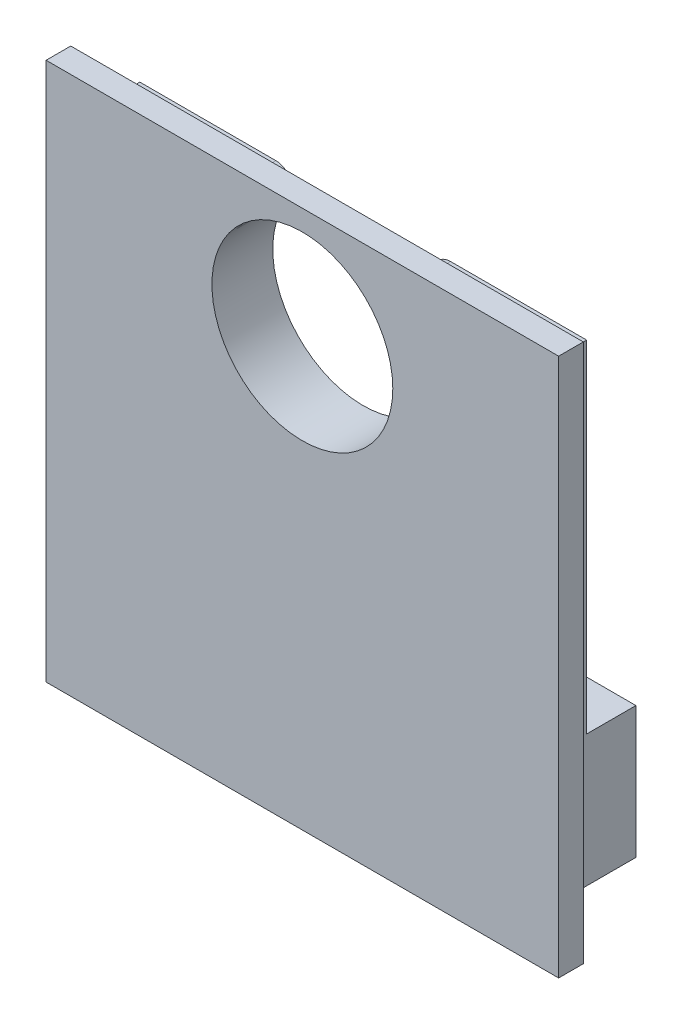
ISO-10303-21;
HEADER;
FILE_DESCRIPTION(('STEP AP214'),'2;1');
FILE_NAME('part.step','',(''),(''),'','','');
FILE_SCHEMA(('AUTOMOTIVE_DESIGN { 1 0 10303 214 1 1 1 1 }'));
ENDSEC;
DATA;
#1=APPLICATION_CONTEXT('core data for automotive mechanical design processes');
#2=APPLICATION_PROTOCOL_DEFINITION('international standard','automotive_design',2000,#1);
#3=PRODUCT_CONTEXT('',#1,'mechanical');
#4=PRODUCT('Part','Part','',(#3));
#5=PRODUCT_RELATED_PRODUCT_CATEGORY('part','',(#4));
#6=PRODUCT_DEFINITION_FORMATION('','',#4);
#7=PRODUCT_DEFINITION_CONTEXT('part definition',#1,'design');
#8=PRODUCT_DEFINITION('design','',#6,#7);
#9=PRODUCT_DEFINITION_SHAPE('','',#8);
#10=(LENGTH_UNIT() NAMED_UNIT(*) SI_UNIT(.MILLI.,.METRE.));
#11=(NAMED_UNIT(*) PLANE_ANGLE_UNIT() SI_UNIT($,.RADIAN.));
#12=(NAMED_UNIT(*) SI_UNIT($,.STERADIAN.) SOLID_ANGLE_UNIT());
#13=UNCERTAINTY_MEASURE_WITH_UNIT(LENGTH_MEASURE(1.E-05),#10,'distance_accuracy_value','');
#14=(GEOMETRIC_REPRESENTATION_CONTEXT(3) GLOBAL_UNCERTAINTY_ASSIGNED_CONTEXT((#13)) GLOBAL_UNIT_ASSIGNED_CONTEXT((#10,
#11,#12)) REPRESENTATION_CONTEXT('',''));
#15=CARTESIAN_POINT('',(0.,0.,0.));
#16=DIRECTION('',(0.,0.,1.));
#17=DIRECTION('',(1.,0.,0.));
#18=AXIS2_PLACEMENT_3D('',#15,#16,#17);
#19=CARTESIAN_POINT('',(-13.585,4.74999999999999,2.2));
#20=DIRECTION('',(0.,-1.,0.));
#21=DIRECTION('',(0.,0.,-1.));
#22=AXIS2_PLACEMENT_3D('',#19,#20,#21);
#23=PLANE('',#22);
#24=DIRECTION('',(-1.,0.,0.));
#25=VECTOR('',#24,1.);
#26=CARTESIAN_POINT('',(-13.585,4.74999999999999,0.));
#27=LINE('',#26,#25);
#28=CARTESIAN_POINT('',(13.585,4.74999999999999,0.));
#29=VERTEX_POINT('',#28);
#30=CARTESIAN_POINT('',(5.30919014539883,4.74999999999999,0.));
#31=VERTEX_POINT('',#30);
#32=EDGE_CURVE('E230',#29,#31,#27,.T.);
#33=ORIENTED_EDGE('',*,*,#32,.T.);
#34=DIRECTION('',(0.,0.,1.));
#35=VECTOR('',#34,1.);
#36=CARTESIAN_POINT('',(5.30919014539883,4.74999999999999,2.2));
#37=LINE('',#36,#35);
#38=CARTESIAN_POINT('',(5.30919014539883,4.74999999999999,2.2));
#39=VERTEX_POINT('',#38);
#40=EDGE_CURVE('E257',#31,#39,#37,.T.);
#41=ORIENTED_EDGE('',*,*,#40,.T.);
#42=DIRECTION('',(-1.,0.,0.));
#43=VECTOR('',#42,1.);
#44=CARTESIAN_POINT('',(-13.585,4.74999999999999,2.2));
#45=LINE('',#44,#43);
#46=CARTESIAN_POINT('',(13.585,4.74999999999999,2.2));
#47=VERTEX_POINT('',#46);
#48=EDGE_CURVE('E221',#47,#39,#45,.T.);
#49=ORIENTED_EDGE('',*,*,#48,.F.);
#50=DIRECTION('',(0.,0.,-1.));
#51=VECTOR('',#50,1.);
#52=CARTESIAN_POINT('',(13.585,4.74999999999999,2.2));
#53=LINE('',#52,#51);
#54=EDGE_CURVE('E239',#47,#29,#53,.T.);
#55=ORIENTED_EDGE('',*,*,#54,.T.);
#56=EDGE_LOOP('',(#33,#41,#49,#55));
#57=FACE_BOUND('',#56,.T.);
#58=ADVANCED_FACE('F33',(#57),#23,.F.);
#59=CARTESIAN_POINT('',(13.585,-24.,2.2));
#60=DIRECTION('',(-1.,0.,0.));
#61=DIRECTION('',(0.,0.,1.));
#62=AXIS2_PLACEMENT_3D('',#59,#60,#61);
#63=PLANE('',#62);
#64=DIRECTION('',(0.,0.,-1.));
#65=VECTOR('',#64,1.);
#66=CARTESIAN_POINT('',(13.585,-24.,2.2));
#67=LINE('',#66,#65);
#68=CARTESIAN_POINT('',(13.585,-24.,2.2));
#69=VERTEX_POINT('',#68);
#70=CARTESIAN_POINT('',(13.585,-24.,-3.));
#71=VERTEX_POINT('',#70);
#72=EDGE_CURVE('E145',#69,#71,#67,.T.);
#73=ORIENTED_EDGE('',*,*,#72,.T.);
#74=DIRECTION('',(0.,-1.,0.));
#75=VECTOR('',#74,1.);
#76=CARTESIAN_POINT('',(13.585,-24.,-3.));
#77=LINE('',#76,#75);
#78=CARTESIAN_POINT('',(13.585,-16.,-3.));
#79=VERTEX_POINT('',#78);
#80=EDGE_CURVE('E150',#79,#71,#77,.T.);
#81=ORIENTED_EDGE('',*,*,#80,.F.);
#82=DIRECTION('',(0.,0.,1.));
#83=VECTOR('',#82,1.);
#84=CARTESIAN_POINT('',(13.585,-16.,-3.));
#85=LINE('',#84,#83);
#86=CARTESIAN_POINT('',(13.585,-16.,0.));
#87=VERTEX_POINT('',#86);
#88=EDGE_CURVE('E177',#79,#87,#85,.T.);
#89=ORIENTED_EDGE('',*,*,#88,.T.);
#90=DIRECTION('',(0.,1.,0.));
#91=VECTOR('',#90,1.);
#92=CARTESIAN_POINT('',(13.585,-24.,0.));
#93=LINE('',#92,#91);
#94=EDGE_CURVE('E217',#87,#29,#93,.T.);
#95=ORIENTED_EDGE('',*,*,#94,.T.);
#96=ORIENTED_EDGE('',*,*,#54,.F.);
#97=DIRECTION('',(0.,1.,0.));
#98=VECTOR('',#97,1.);
#99=CARTESIAN_POINT('',(13.585,-24.,2.2));
#100=LINE('',#99,#98);
#101=EDGE_CURVE('E153',#69,#47,#100,.T.);
#102=ORIENTED_EDGE('',*,*,#101,.F.);
#103=EDGE_LOOP('',(#73,#81,#89,#95,#96,#102));
#104=FACE_BOUND('',#103,.T.);
#105=ADVANCED_FACE('F147',(#104),#63,.F.);
#106=CARTESIAN_POINT('',(-5.30919014539883,4.74999999999999,2.2));
#107=VERTEX_POINT('',#106);
#108=CARTESIAN_POINT('',(-13.585,4.74999999999999,2.2));
#109=VERTEX_POINT('',#108);
#110=EDGE_CURVE('E219',#107,#109,#45,.T.);
#111=ORIENTED_EDGE('',*,*,#110,.F.);
#112=DIRECTION('',(0.,0.,1.));
#113=VECTOR('',#112,1.);
#114=CARTESIAN_POINT('',(-5.30919014539883,4.74999999999999,2.2));
#115=LINE('',#114,#113);
#116=CARTESIAN_POINT('',(-5.30919014539883,4.74999999999999,0.));
#117=VERTEX_POINT('',#116);
#118=EDGE_CURVE('E242',#107,#117,#115,.F.);
#119=ORIENTED_EDGE('',*,*,#118,.T.);
#120=CARTESIAN_POINT('',(-13.585,4.74999999999999,0.));
#121=VERTEX_POINT('',#120);
#122=EDGE_CURVE('E229',#117,#121,#27,.T.);
#123=ORIENTED_EDGE('',*,*,#122,.T.);
#124=DIRECTION('',(0.,0.,-1.));
#125=VECTOR('',#124,1.);
#126=CARTESIAN_POINT('',(-13.585,4.74999999999999,2.2));
#127=LINE('',#126,#125);
#128=EDGE_CURVE('E236',#109,#121,#127,.T.);
#129=ORIENTED_EDGE('',*,*,#128,.F.);
#130=EDGE_LOOP('',(#111,#119,#123,#129));
#131=FACE_BOUND('',#130,.T.);
#132=ADVANCED_FACE('F279',(#131),#23,.F.);
#133=CARTESIAN_POINT('',(-13.585,-24.,2.2));
#134=DIRECTION('',(1.,0.,0.));
#135=DIRECTION('',(0.,0.,-1.));
#136=AXIS2_PLACEMENT_3D('',#133,#134,#135);
#137=PLANE('',#136);
#138=DIRECTION('',(0.,-1.,0.));
#139=VECTOR('',#138,1.);
#140=CARTESIAN_POINT('',(-13.585,-24.,0.));
#141=LINE('',#140,#139);
#142=CARTESIAN_POINT('',(-13.585,-16.,0.));
#143=VERTEX_POINT('',#142);
#144=EDGE_CURVE('E220',#121,#143,#141,.T.);
#145=ORIENTED_EDGE('',*,*,#144,.T.);
#146=DIRECTION('',(0.,0.,1.));
#147=VECTOR('',#146,1.);
#148=CARTESIAN_POINT('',(-13.585,-16.,-3.));
#149=LINE('',#148,#147);
#150=CARTESIAN_POINT('',(-13.585,-16.,-3.));
#151=VERTEX_POINT('',#150);
#152=EDGE_CURVE('E180',#151,#143,#149,.T.);
#153=ORIENTED_EDGE('',*,*,#152,.F.);
#154=DIRECTION('',(0.,1.,0.));
#155=VECTOR('',#154,1.);
#156=CARTESIAN_POINT('',(-13.585,-24.,-3.));
#157=LINE('',#156,#155);
#158=CARTESIAN_POINT('',(-13.585,-24.,-3.));
#159=VERTEX_POINT('',#158);
#160=EDGE_CURVE('E165',#159,#151,#157,.T.);
#161=ORIENTED_EDGE('',*,*,#160,.F.);
#162=DIRECTION('',(0.,0.,-1.));
#163=VECTOR('',#162,1.);
#164=CARTESIAN_POINT('',(-13.585,-24.,2.2));
#165=LINE('',#164,#163);
#166=CARTESIAN_POINT('',(-13.585,-24.,2.2));
#167=VERTEX_POINT('',#166);
#168=EDGE_CURVE('E157',#167,#159,#165,.T.);
#169=ORIENTED_EDGE('',*,*,#168,.F.);
#170=DIRECTION('',(0.,-1.,0.));
#171=VECTOR('',#170,1.);
#172=CARTESIAN_POINT('',(-13.585,-24.,2.2));
#173=LINE('',#172,#171);
#174=EDGE_CURVE('E224',#109,#167,#173,.T.);
#175=ORIENTED_EDGE('',*,*,#174,.F.);
#176=ORIENTED_EDGE('',*,*,#128,.T.);
#177=EDGE_LOOP('',(#145,#153,#161,#169,#175,#176));
#178=FACE_BOUND('',#177,.T.);
#179=ADVANCED_FACE('F286',(#178),#137,.F.);
#180=CARTESIAN_POINT('',(-13.585,-24.,2.2));
#181=DIRECTION('',(0.,1.,0.));
#182=DIRECTION('',(0.,0.,1.));
#183=AXIS2_PLACEMENT_3D('',#180,#181,#182);
#184=PLANE('',#183);
#185=ORIENTED_EDGE('',*,*,#168,.T.);
#186=DIRECTION('',(-1.,0.,0.));
#187=VECTOR('',#186,1.);
#188=CARTESIAN_POINT('',(13.585,-24.,-3.));
#189=LINE('',#188,#187);
#190=EDGE_CURVE('E161',#71,#159,#189,.T.);
#191=ORIENTED_EDGE('',*,*,#190,.F.);
#192=ORIENTED_EDGE('',*,*,#72,.F.);
#193=DIRECTION('',(1.,0.,0.));
#194=VECTOR('',#193,1.);
#195=CARTESIAN_POINT('',(-13.585,-24.,2.2));
#196=LINE('',#195,#194);
#197=EDGE_CURVE('E158',#167,#69,#196,.T.);
#198=ORIENTED_EDGE('',*,*,#197,.F.);
#199=EDGE_LOOP('',(#185,#191,#192,#198));
#200=FACE_BOUND('',#199,.T.);
#201=ADVANCED_FACE('F162',(#200),#184,.F.);
#202=CARTESIAN_POINT('',(0.,0.,0.));
#203=DIRECTION('',(0.,0.,-1.));
#204=DIRECTION('',(-1.,0.,0.));
#205=AXIS2_PLACEMENT_3D('',#202,#203,#204);
#206=PLANE('',#205);
#207=ORIENTED_EDGE('',*,*,#122,.F.);
#208=CARTESIAN_POINT('',(-5.30919014539883,3.74999999999999,0.));
#209=DIRECTION('',(0.,0.,-1.));
#210=DIRECTION('',(-1.,0.,0.));
#211=AXIS2_PLACEMENT_3D('',#208,#209,#210);
#212=CIRCLE('',#211,1.);
#213=CARTESIAN_POINT('',(-4.49239166149132,3.17307692307691,0.));
#214=VERTEX_POINT('',#213);
#215=EDGE_CURVE('E249',#117,#214,#212,.T.);
#216=ORIENTED_EDGE('',*,*,#215,.T.);
#217=CARTESIAN_POINT('',(0.,0.,0.));
#218=DIRECTION('',(0.,0.,1.));
#219=DIRECTION('',(1.,0.,0.));
#220=AXIS2_PLACEMENT_3D('',#217,#218,#219);
#221=CIRCLE('',#220,5.5);
#222=CARTESIAN_POINT('',(4.49239166149132,3.17307692307691,0.));
#223=VERTEX_POINT('',#222);
#224=EDGE_CURVE('E183',#214,#223,#221,.T.);
#225=ORIENTED_EDGE('',*,*,#224,.T.);
#226=CARTESIAN_POINT('',(5.30919014539883,3.74999999999999,0.));
#227=DIRECTION('',(0.,0.,-1.));
#228=DIRECTION('',(-1.,0.,0.));
#229=AXIS2_PLACEMENT_3D('',#226,#227,#228);
#230=CIRCLE('',#229,1.);
#231=EDGE_CURVE('E247',#223,#31,#230,.T.);
#232=ORIENTED_EDGE('',*,*,#231,.T.);
#233=ORIENTED_EDGE('',*,*,#32,.F.);
#234=ORIENTED_EDGE('',*,*,#94,.F.);
#235=DIRECTION('',(1.,0.,0.));
#236=VECTOR('',#235,1.);
#237=CARTESIAN_POINT('',(13.585,-16.,0.));
#238=LINE('',#237,#236);
#239=EDGE_CURVE('E171',#143,#87,#238,.T.);
#240=ORIENTED_EDGE('',*,*,#239,.F.);
#241=ORIENTED_EDGE('',*,*,#144,.F.);
#242=EDGE_LOOP('',(#207,#216,#225,#232,#233,#234,#240,#241));
#243=FACE_BOUND('',#242,.T.);
#244=ADVANCED_FACE('F302',(#243),#206,.T.);
#245=CARTESIAN_POINT('',(0.,0.,2.2));
#246=DIRECTION('',(0.,0.,1.));
#247=DIRECTION('',(1.,0.,0.));
#248=AXIS2_PLACEMENT_3D('',#245,#246,#247);
#249=PLANE('',#248);
#250=DIRECTION('',(1.,0.,0.));
#251=VECTOR('',#250,1.);
#252=CARTESIAN_POINT('',(-15.585,-26.,2.2));
#253=LINE('',#252,#251);
#254=CARTESIAN_POINT('',(-15.585,-26.,2.2));
#255=VERTEX_POINT('',#254);
#256=CARTESIAN_POINT('',(15.585,-26.,2.2));
#257=VERTEX_POINT('',#256);
#258=EDGE_CURVE('E198',#255,#257,#253,.T.);
#259=ORIENTED_EDGE('',*,*,#258,.F.);
#260=DIRECTION('',(0.,-1.,0.));
#261=VECTOR('',#260,1.);
#262=CARTESIAN_POINT('',(-15.585,6.74999999999999,2.2));
#263=LINE('',#262,#261);
#264=CARTESIAN_POINT('',(-15.585,6.74999999999999,2.2));
#265=VERTEX_POINT('',#264);
#266=EDGE_CURVE('E191',#265,#255,#263,.T.);
#267=ORIENTED_EDGE('',*,*,#266,.F.);
#268=DIRECTION('',(-1.,0.,0.));
#269=VECTOR('',#268,1.);
#270=CARTESIAN_POINT('',(15.585,6.74999999999999,2.2));
#271=LINE('',#270,#269);
#272=CARTESIAN_POINT('',(15.585,6.74999999999999,2.2));
#273=VERTEX_POINT('',#272);
#274=EDGE_CURVE('E203',#273,#265,#271,.T.);
#275=ORIENTED_EDGE('',*,*,#274,.F.);
#276=DIRECTION('',(0.,1.,0.));
#277=VECTOR('',#276,1.);
#278=CARTESIAN_POINT('',(15.585,-26.,2.2));
#279=LINE('',#278,#277);
#280=EDGE_CURVE('E201',#257,#273,#279,.T.);
#281=ORIENTED_EDGE('',*,*,#280,.F.);
#282=EDGE_LOOP('',(#259,#267,#275,#281));
#283=FACE_BOUND('',#282,.T.);
#284=CARTESIAN_POINT('',(5.30919014539883,3.74999999999999,2.2));
#285=DIRECTION('',(0.,0.,1.));
#286=DIRECTION('',(1.,0.,0.));
#287=AXIS2_PLACEMENT_3D('',#284,#285,#286);
#288=CIRCLE('',#287,1.);
#289=CARTESIAN_POINT('',(4.67114582133424,4.51999963670702,2.2));
#290=VERTEX_POINT('',#289);
#291=EDGE_CURVE('E11',#39,#290,#288,.T.);
#292=ORIENTED_EDGE('',*,*,#291,.T.);
#293=CARTESIAN_POINT('',(0.,0.,2.2));
#294=DIRECTION('',(0.,0.,1.));
#295=DIRECTION('',(1.,0.,0.));
#296=AXIS2_PLACEMENT_3D('',#293,#294,#295);
#297=CIRCLE('',#296,6.5);
#298=CARTESIAN_POINT('',(-4.67114582133424,4.51999963670702,2.2));
#299=VERTEX_POINT('',#298);
#300=EDGE_CURVE('E56',#290,#299,#297,.T.);
#301=ORIENTED_EDGE('',*,*,#300,.T.);
#302=CARTESIAN_POINT('',(-5.30919014539883,3.74999999999999,2.2));
#303=DIRECTION('',(0.,0.,1.));
#304=DIRECTION('',(1.,0.,0.));
#305=AXIS2_PLACEMENT_3D('',#302,#303,#304);
#306=CIRCLE('',#305,1.);
#307=EDGE_CURVE('E48',#299,#107,#306,.T.);
#308=ORIENTED_EDGE('',*,*,#307,.T.);
#309=ORIENTED_EDGE('',*,*,#110,.T.);
#310=ORIENTED_EDGE('',*,*,#174,.T.);
#311=ORIENTED_EDGE('',*,*,#197,.T.);
#312=ORIENTED_EDGE('',*,*,#101,.T.);
#313=ORIENTED_EDGE('',*,*,#48,.T.);
#314=EDGE_LOOP('',(#292,#301,#308,#309,#310,#311,#312,#313));
#315=FACE_BOUND('',#314,.T.);
#316=ADVANCED_FACE('F315',(#283,#315),#249,.F.);
#317=CARTESIAN_POINT('',(-15.585,-26.,3.7));
#318=DIRECTION('',(0.,1.,0.));
#319=DIRECTION('',(0.,0.,1.));
#320=AXIS2_PLACEMENT_3D('',#317,#318,#319);
#321=PLANE('',#320);
#322=ORIENTED_EDGE('',*,*,#258,.T.);
#323=DIRECTION('',(0.,0.,-1.));
#324=VECTOR('',#323,1.);
#325=CARTESIAN_POINT('',(15.585,-26.,3.7));
#326=LINE('',#325,#324);
#327=CARTESIAN_POINT('',(15.585,-26.,3.7));
#328=VERTEX_POINT('',#327);
#329=EDGE_CURVE('E214',#328,#257,#326,.T.);
#330=ORIENTED_EDGE('',*,*,#329,.F.);
#331=DIRECTION('',(1.,0.,0.));
#332=VECTOR('',#331,1.);
#333=CARTESIAN_POINT('',(-15.585,-26.,3.7));
#334=LINE('',#333,#332);
#335=CARTESIAN_POINT('',(-15.585,-26.,3.7));
#336=VERTEX_POINT('',#335);
#337=EDGE_CURVE('E187',#336,#328,#334,.T.);
#338=ORIENTED_EDGE('',*,*,#337,.F.);
#339=DIRECTION('',(0.,0.,-1.));
#340=VECTOR('',#339,1.);
#341=CARTESIAN_POINT('',(-15.585,-26.,3.7));
#342=LINE('',#341,#340);
#343=EDGE_CURVE('E197',#336,#255,#342,.T.);
#344=ORIENTED_EDGE('',*,*,#343,.T.);
#345=EDGE_LOOP('',(#322,#330,#338,#344));
#346=FACE_BOUND('',#345,.T.);
#347=ADVANCED_FACE('F336',(#346),#321,.F.);
#348=CARTESIAN_POINT('',(15.585,-26.,3.7));
#349=DIRECTION('',(-1.,0.,0.));
#350=DIRECTION('',(0.,0.,1.));
#351=AXIS2_PLACEMENT_3D('',#348,#349,#350);
#352=PLANE('',#351);
#353=ORIENTED_EDGE('',*,*,#280,.T.);
#354=DIRECTION('',(0.,0.,-1.));
#355=VECTOR('',#354,1.);
#356=CARTESIAN_POINT('',(15.585,6.74999999999999,3.7));
#357=LINE('',#356,#355);
#358=CARTESIAN_POINT('',(15.585,6.74999999999999,3.7));
#359=VERTEX_POINT('',#358);
#360=EDGE_CURVE('E211',#359,#273,#357,.T.);
#361=ORIENTED_EDGE('',*,*,#360,.F.);
#362=DIRECTION('',(0.,1.,0.));
#363=VECTOR('',#362,1.);
#364=CARTESIAN_POINT('',(15.585,-26.,3.7));
#365=LINE('',#364,#363);
#366=EDGE_CURVE('E190',#328,#359,#365,.T.);
#367=ORIENTED_EDGE('',*,*,#366,.F.);
#368=ORIENTED_EDGE('',*,*,#329,.T.);
#369=EDGE_LOOP('',(#353,#361,#367,#368));
#370=FACE_BOUND('',#369,.T.);
#371=ADVANCED_FACE('F344',(#370),#352,.F.);
#372=CARTESIAN_POINT('',(15.585,6.74999999999999,3.7));
#373=DIRECTION('',(0.,-1.,0.));
#374=DIRECTION('',(0.,0.,-1.));
#375=AXIS2_PLACEMENT_3D('',#372,#373,#374);
#376=PLANE('',#375);
#377=ORIENTED_EDGE('',*,*,#274,.T.);
#378=DIRECTION('',(0.,0.,-1.));
#379=VECTOR('',#378,1.);
#380=CARTESIAN_POINT('',(-15.585,6.74999999999999,3.7));
#381=LINE('',#380,#379);
#382=CARTESIAN_POINT('',(-15.585,6.74999999999999,3.7));
#383=VERTEX_POINT('',#382);
#384=EDGE_CURVE('E208',#383,#265,#381,.T.);
#385=ORIENTED_EDGE('',*,*,#384,.F.);
#386=DIRECTION('',(-1.,0.,0.));
#387=VECTOR('',#386,1.);
#388=CARTESIAN_POINT('',(15.585,6.74999999999999,3.7));
#389=LINE('',#388,#387);
#390=EDGE_CURVE('E193',#359,#383,#389,.T.);
#391=ORIENTED_EDGE('',*,*,#390,.F.);
#392=ORIENTED_EDGE('',*,*,#360,.T.);
#393=EDGE_LOOP('',(#377,#385,#391,#392));
#394=FACE_BOUND('',#393,.T.);
#395=ADVANCED_FACE('F340',(#394),#376,.F.);
#396=CARTESIAN_POINT('',(-15.585,6.74999999999999,3.7));
#397=DIRECTION('',(1.,0.,0.));
#398=DIRECTION('',(0.,0.,-1.));
#399=AXIS2_PLACEMENT_3D('',#396,#397,#398);
#400=PLANE('',#399);
#401=ORIENTED_EDGE('',*,*,#266,.T.);
#402=ORIENTED_EDGE('',*,*,#343,.F.);
#403=DIRECTION('',(0.,-1.,0.));
#404=VECTOR('',#403,1.);
#405=CARTESIAN_POINT('',(-15.585,6.74999999999999,3.7));
#406=LINE('',#405,#404);
#407=EDGE_CURVE('E195',#383,#336,#406,.T.);
#408=ORIENTED_EDGE('',*,*,#407,.F.);
#409=ORIENTED_EDGE('',*,*,#384,.T.);
#410=EDGE_LOOP('',(#401,#402,#408,#409));
#411=FACE_BOUND('',#410,.T.);
#412=ADVANCED_FACE('F332',(#411),#400,.F.);
#413=CARTESIAN_POINT('',(0.,0.,3.7));
#414=DIRECTION('',(0.,0.,1.));
#415=DIRECTION('',(1.,0.,0.));
#416=AXIS2_PLACEMENT_3D('',#413,#414,#415);
#417=PLANE('',#416);
#418=CARTESIAN_POINT('',(0.,0.,3.7));
#419=DIRECTION('',(0.,0.,1.));
#420=DIRECTION('',(1.,0.,0.));
#421=AXIS2_PLACEMENT_3D('',#418,#419,#420);
#422=CIRCLE('',#421,5.5);
#423=CARTESIAN_POINT('',(5.5,0.,3.7));
#424=VERTEX_POINT('',#423);
#425=EDGE_CURVE('E186',#424,#424,#422,.T.);
#426=ORIENTED_EDGE('',*,*,#425,.F.);
#427=EDGE_LOOP('',(#426));
#428=FACE_BOUND('',#427,.T.);
#429=ORIENTED_EDGE('',*,*,#337,.T.);
#430=ORIENTED_EDGE('',*,*,#366,.T.);
#431=ORIENTED_EDGE('',*,*,#390,.T.);
#432=ORIENTED_EDGE('',*,*,#407,.T.);
#433=EDGE_LOOP('',(#429,#430,#431,#432));
#434=FACE_BOUND('',#433,.T.);
#435=ADVANCED_FACE('F327',(#428,#434),#417,.T.);
#436=CARTESIAN_POINT('',(0.,0.,0.));
#437=DIRECTION('',(0.,0.,1.));
#438=DIRECTION('',(1.,0.,0.));
#439=AXIS2_PLACEMENT_3D('',#436,#437,#438);
#440=CYLINDRICAL_SURFACE('',#439,5.5);
#441=ORIENTED_EDGE('',*,*,#224,.F.);
#442=DIRECTION('',(0.,0.,1.));
#443=VECTOR('',#442,1.);
#444=CARTESIAN_POINT('',(-4.49239166149132,3.17307692307692,0.));
#445=LINE('',#444,#443);
#446=CARTESIAN_POINT('',(-4.49239166149132,3.17307692307691,3.2));
#447=VERTEX_POINT('',#446);
#448=EDGE_CURVE('E255',#214,#447,#445,.T.);
#449=ORIENTED_EDGE('',*,*,#448,.T.);
#450=CARTESIAN_POINT('',(0.,0.,3.2));
#451=DIRECTION('',(0.,0.,1.));
#452=DIRECTION('',(1.,0.,0.));
#453=AXIS2_PLACEMENT_3D('',#450,#451,#452);
#454=CIRCLE('',#453,5.5);
#455=CARTESIAN_POINT('',(4.49239166149132,3.17307692307691,3.2));
#456=VERTEX_POINT('',#455);
#457=EDGE_CURVE('E251',#447,#456,#454,.F.);
#458=ORIENTED_EDGE('',*,*,#457,.T.);
#459=DIRECTION('',(0.,0.,1.));
#460=VECTOR('',#459,1.);
#461=CARTESIAN_POINT('',(4.49239166149132,3.17307692307692,0.));
#462=LINE('',#461,#460);
#463=EDGE_CURVE('E253',#456,#223,#462,.F.);
#464=ORIENTED_EDGE('',*,*,#463,.T.);
#465=EDGE_LOOP('',(#441,#449,#458,#464));
#466=FACE_BOUND('',#465,.T.);
#467=ORIENTED_EDGE('',*,*,#425,.T.);
#468=EDGE_LOOP('',(#467));
#469=FACE_BOUND('',#468,.T.);
#470=ADVANCED_FACE('F306',(#466,#469),#440,.F.);
#471=CARTESIAN_POINT('',(13.585,-16.,-3.));
#472=DIRECTION('',(0.,-1.,0.));
#473=DIRECTION('',(0.,0.,-1.));
#474=AXIS2_PLACEMENT_3D('',#471,#472,#473);
#475=PLANE('',#474);
#476=ORIENTED_EDGE('',*,*,#239,.T.);
#477=ORIENTED_EDGE('',*,*,#88,.F.);
#478=DIRECTION('',(1.,0.,0.));
#479=VECTOR('',#478,1.);
#480=CARTESIAN_POINT('',(13.585,-16.,-3.));
#481=LINE('',#480,#479);
#482=EDGE_CURVE('E169',#151,#79,#481,.T.);
#483=ORIENTED_EDGE('',*,*,#482,.F.);
#484=ORIENTED_EDGE('',*,*,#152,.T.);
#485=EDGE_LOOP('',(#476,#477,#483,#484));
#486=FACE_BOUND('',#485,.T.);
#487=ADVANCED_FACE('F318',(#486),#475,.F.);
#488=CARTESIAN_POINT('',(0.,0.,-3.));
#489=DIRECTION('',(0.,0.,1.));
#490=DIRECTION('',(1.,0.,0.));
#491=AXIS2_PLACEMENT_3D('',#488,#489,#490);
#492=PLANE('',#491);
#493=ORIENTED_EDGE('',*,*,#80,.T.);
#494=ORIENTED_EDGE('',*,*,#190,.T.);
#495=ORIENTED_EDGE('',*,*,#160,.T.);
#496=ORIENTED_EDGE('',*,*,#482,.T.);
#497=EDGE_LOOP('',(#493,#494,#495,#496));
#498=FACE_BOUND('',#497,.T.);
#499=ADVANCED_FACE('F167',(#498),#492,.F.);
#500=CARTESIAN_POINT('',(5.30919014539883,3.74999999999999,0.));
#501=DIRECTION('',(0.,0.,1.));
#502=DIRECTION('',(1.,0.,0.));
#503=AXIS2_PLACEMENT_3D('',#500,#501,#502);
#504=CYLINDRICAL_SURFACE('',#503,1.);
#505=ORIENTED_EDGE('',*,*,#231,.F.);
#506=ORIENTED_EDGE('',*,*,#463,.F.);
#507=CARTESIAN_POINT('',(4.67114582133424,4.51999963670702,2.2));
#508=CARTESIAN_POINT('',(4.65416771821917,4.505934740841,2.19999727765736));
#509=CARTESIAN_POINT('',(4.63766816584874,4.49131125377328,2.20072553426062));
#510=CARTESIAN_POINT('',(4.60574404165841,4.46108771723399,2.20363343976512));
#511=CARTESIAN_POINT('',(4.59031882116111,4.44548826803845,2.20581220431443));
#512=CARTESIAN_POINT('',(4.54607051774064,4.39770086734364,2.21445711847536));
#513=CARTESIAN_POINT('',(4.51896293246553,4.36426367525703,2.22303244388593));
#514=CARTESIAN_POINT('',(4.47000703140381,4.2954871463854,2.24529306073308));
#515=CARTESIAN_POINT('',(4.44814837952523,4.26015171839221,2.25896817185117));
#516=CARTESIAN_POINT('',(4.40957775878586,4.18858268477993,2.29067609158502));
#517=CARTESIAN_POINT('',(4.39287618503534,4.15234742207846,2.3087175726591));
#518=CARTESIAN_POINT('',(4.35865190061677,4.06536237528118,2.35628060490463));
#519=CARTESIAN_POINT('',(4.34348649141486,4.01462003095782,2.38750435062479));
#520=CARTESIAN_POINT('',(4.3215043782507,3.91464656767945,2.45490887368345));
#521=CARTESIAN_POINT('',(4.31470640388915,3.86541907864472,2.49110057086405));
#522=CARTESIAN_POINT('',(4.30672486420237,3.74721068960685,2.58429068597232));
#523=CARTESIAN_POINT('',(4.3095359123096,3.67950298635667,2.64322973865738));
#524=CARTESIAN_POINT('',(4.3272507951307,3.54978150388121,2.76527759729028));
#525=CARTESIAN_POINT('',(4.34216820809181,3.48777420509125,2.82839101207342));
#526=CARTESIAN_POINT('',(4.37769444811513,3.38307283646338,2.94223117121958));
#527=CARTESIAN_POINT('',(4.3962504213862,3.33918434347925,2.99252765091841));
#528=CARTESIAN_POINT('',(4.438968584229,3.25509172535438,3.09367350325067));
#529=CARTESIAN_POINT('',(4.46312048989925,3.21488102816158,3.14452170053581));
#530=CARTESIAN_POINT('',(4.49074735306835,3.17541021748183,3.19689686308898));
#531=CARTESIAN_POINT('',(4.4915682715093,3.17424267896044,3.19844844795191));
#532=CARTESIAN_POINT('',(4.49239166149132,3.17307692307691,3.2));
#533=B_SPLINE_CURVE_WITH_KNOTS('',3,(#507,#508,#509,#510,#511,#512,#513,#514,#515,#516,#517,
#518,#519,#520,#521,#522,#523,#524,#525,#526,#527,#528,#529,#530,#531,#532),.UNSPECIFIED.,.F.,
.F.,(4,2,2,2,2,2,2,2,2,2,2,2,4),(0.,0.0660936850730319,0.1321471107208,0.26305439813081,
0.393701751939042,0.52461075762954,0.708024139630813,0.891847330462583,1.15981875018622,
1.42809113713254,1.63563319994315,1.8427968367018,1.84912139866519),.UNSPECIFIED.);
#534=EDGE_CURVE('E38',#290,#456,#533,.T.);
#535=ORIENTED_EDGE('',*,*,#534,.F.);
#536=ORIENTED_EDGE('',*,*,#291,.F.);
#537=ORIENTED_EDGE('',*,*,#40,.F.);
#538=EDGE_LOOP('',(#505,#506,#535,#536,#537));
#539=FACE_BOUND('',#538,.T.);
#540=ADVANCED_FACE('F35',(#539),#504,.T.);
#541=CARTESIAN_POINT('',(0.,0.,3.2));
#542=DIRECTION('',(0.,0.,1.));
#543=DIRECTION('',(1.,0.,0.));
#544=AXIS2_PLACEMENT_3D('',#541,#542,#543);
#545=TOROIDAL_SURFACE('',#544,6.5,1.);
#546=ORIENTED_EDGE('',*,*,#534,.T.);
#547=ORIENTED_EDGE('',*,*,#457,.F.);
#548=CARTESIAN_POINT('',(-4.67114582133424,4.51999963670702,2.2));
#549=CARTESIAN_POINT('',(-4.65416771821917,4.505934740841,2.19999727765736));
#550=CARTESIAN_POINT('',(-4.63766816584874,4.49131125377328,2.20072553426062));
#551=CARTESIAN_POINT('',(-4.60574404165841,4.46108771723399,2.20363343976512));
#552=CARTESIAN_POINT('',(-4.59031882116111,4.44548826803845,2.20581220431443));
#553=CARTESIAN_POINT('',(-4.54607051774064,4.39770086734364,2.21445711847536));
#554=CARTESIAN_POINT('',(-4.51896293246553,4.36426367525703,2.22303244388593));
#555=CARTESIAN_POINT('',(-4.47000703140381,4.2954871463854,2.24529306073308));
#556=CARTESIAN_POINT('',(-4.44814837952523,4.26015171839221,2.25896817185117));
#557=CARTESIAN_POINT('',(-4.40957775878586,4.18858268477993,2.29067609158502));
#558=CARTESIAN_POINT('',(-4.39287618503534,4.15234742207846,2.3087175726591));
#559=CARTESIAN_POINT('',(-4.35865190061677,4.06536237528118,2.35628060490463));
#560=CARTESIAN_POINT('',(-4.34348649141486,4.01462003095782,2.38750435062479));
#561=CARTESIAN_POINT('',(-4.3215043782507,3.91464656767945,2.45490887368345));
#562=CARTESIAN_POINT('',(-4.31470640388915,3.86541907864472,2.49110057086405));
#563=CARTESIAN_POINT('',(-4.30672486420237,3.74721068960685,2.58429068597232));
#564=CARTESIAN_POINT('',(-4.3095359123096,3.67950298635667,2.64322973865738));
#565=CARTESIAN_POINT('',(-4.3272507951307,3.54978150388121,2.76527759729028));
#566=CARTESIAN_POINT('',(-4.34216820809181,3.48777420509125,2.82839101207342));
#567=CARTESIAN_POINT('',(-4.37769444811513,3.38307283646338,2.94223117121958));
#568=CARTESIAN_POINT('',(-4.3962504213862,3.33918434347925,2.99252765091841));
#569=CARTESIAN_POINT('',(-4.438968584229,3.25509172535438,3.09367350325067));
#570=CARTESIAN_POINT('',(-4.46312048989925,3.21488102816158,3.14452170053581));
#571=CARTESIAN_POINT('',(-4.49074735306835,3.17541021748183,3.19689686308898));
#572=CARTESIAN_POINT('',(-4.4915682715093,3.17424267896044,3.19844844795191));
#573=CARTESIAN_POINT('',(-4.49239166149132,3.17307692307691,3.2));
#574=B_SPLINE_CURVE_WITH_KNOTS('',3,(#548,#549,#550,#551,#552,#553,#554,#555,#556,#557,#558,
#559,#560,#561,#562,#563,#564,#565,#566,#567,#568,#569,#570,#571,#572,#573),.UNSPECIFIED.,.F.,
.F.,(4,2,2,2,2,2,2,2,2,2,2,2,4),(0.,0.0660936850730319,0.1321471107208,0.26305439813081,
0.393701751939042,0.52461075762954,0.708024139630813,0.891847330462583,1.15981875018622,
1.42809113713254,1.63563319994315,1.8427968367018,1.84912139866519),.UNSPECIFIED.);
#575=EDGE_CURVE('E260',#299,#447,#574,.T.);
#576=ORIENTED_EDGE('',*,*,#575,.F.);
#577=ORIENTED_EDGE('',*,*,#300,.F.);
#578=EDGE_LOOP('',(#546,#547,#576,#577));
#579=FACE_BOUND('',#578,.T.);
#580=ADVANCED_FACE('F266',(#579),#545,.T.);
#581=CARTESIAN_POINT('',(-5.30919014539883,3.74999999999999,0.));
#582=DIRECTION('',(0.,0.,1.));
#583=DIRECTION('',(1.,0.,0.));
#584=AXIS2_PLACEMENT_3D('',#581,#582,#583);
#585=CYLINDRICAL_SURFACE('',#584,1.);
#586=ORIENTED_EDGE('',*,*,#575,.T.);
#587=ORIENTED_EDGE('',*,*,#448,.F.);
#588=ORIENTED_EDGE('',*,*,#215,.F.);
#589=ORIENTED_EDGE('',*,*,#118,.F.);
#590=ORIENTED_EDGE('',*,*,#307,.F.);
#591=EDGE_LOOP('',(#586,#587,#588,#589,#590));
#592=FACE_BOUND('',#591,.T.);
#593=ADVANCED_FACE('F269',(#592),#585,.T.);
#594=CLOSED_SHELL('',(#58,#105,#132,#179,#201,#244,#316,#347,#371,#395,#412,#435,#470,#487,#499,
#540,#580,#593));
#595=MANIFOLD_SOLID_BREP('B2',#594);
#596=ADVANCED_BREP_SHAPE_REPRESENTATION('',(#18,#595),#14);
#597=SHAPE_DEFINITION_REPRESENTATION(#9,#596);
ENDSEC;
END-ISO-10303-21;
